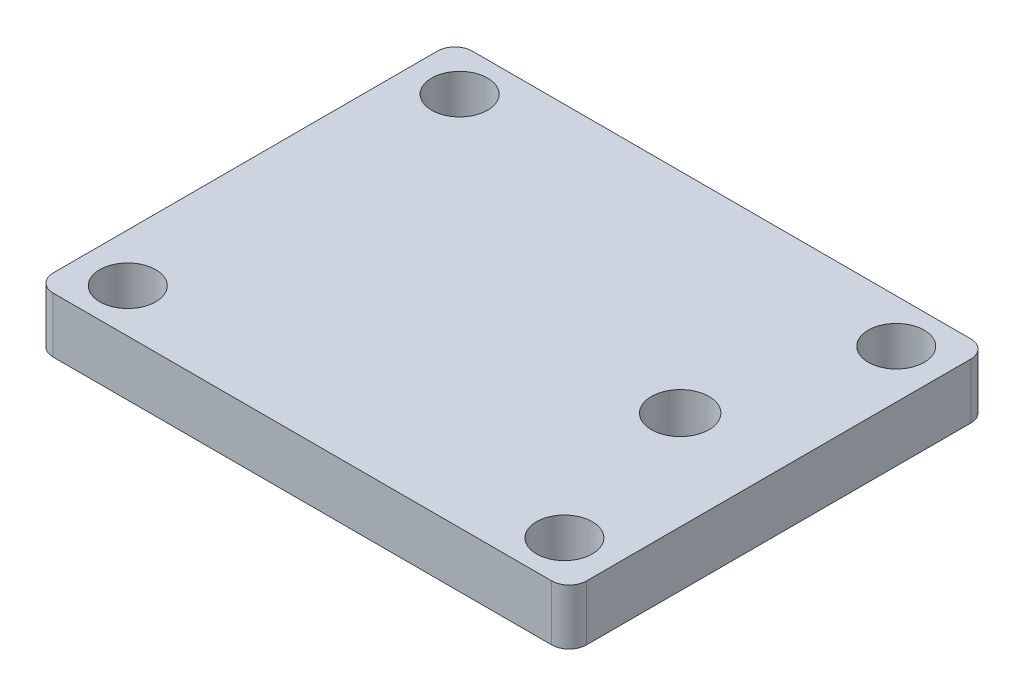
ISO-10303-21;
HEADER;
FILE_DESCRIPTION(('STEP AP214'),'2;1');
FILE_NAME('part.step','',(''),(''),'','','');
FILE_SCHEMA(('AUTOMOTIVE_DESIGN { 1 0 10303 214 1 1 1 1 }'));
ENDSEC;
DATA;
#1=APPLICATION_CONTEXT('core data for automotive mechanical design processes');
#2=APPLICATION_PROTOCOL_DEFINITION('international standard','automotive_design',2000,#1);
#3=PRODUCT_CONTEXT('',#1,'mechanical');
#4=PRODUCT('Part','Part','',(#3));
#5=PRODUCT_RELATED_PRODUCT_CATEGORY('part','',(#4));
#6=PRODUCT_DEFINITION_FORMATION('','',#4);
#7=PRODUCT_DEFINITION_CONTEXT('part definition',#1,'design');
#8=PRODUCT_DEFINITION('design','',#6,#7);
#9=PRODUCT_DEFINITION_SHAPE('','',#8);
#10=(LENGTH_UNIT() NAMED_UNIT(*) SI_UNIT(.MILLI.,.METRE.));
#11=(NAMED_UNIT(*) PLANE_ANGLE_UNIT() SI_UNIT($,.RADIAN.));
#12=(NAMED_UNIT(*) SI_UNIT($,.STERADIAN.) SOLID_ANGLE_UNIT());
#13=UNCERTAINTY_MEASURE_WITH_UNIT(LENGTH_MEASURE(1.E-05),#10,'distance_accuracy_value','');
#14=(GEOMETRIC_REPRESENTATION_CONTEXT(3) GLOBAL_UNCERTAINTY_ASSIGNED_CONTEXT((#13)) GLOBAL_UNIT_ASSIGNED_CONTEXT((#10,
#11,#12)) REPRESENTATION_CONTEXT('',''));
#15=CARTESIAN_POINT('',(0.,0.,0.));
#16=DIRECTION('',(0.,0.,1.));
#17=DIRECTION('',(1.,0.,0.));
#18=AXIS2_PLACEMENT_3D('',#15,#16,#17);
#19=CARTESIAN_POINT('',(0.,3.175,0.));
#20=DIRECTION('',(0.,-1.,0.));
#21=DIRECTION('',(0.,0.,-1.));
#22=AXIS2_PLACEMENT_3D('',#19,#20,#21);
#23=PLANE('',#22);
#24=CARTESIAN_POINT('',(9.62999999999999,3.175,0.));
#25=DIRECTION('',(0.,1.,0.));
#26=DIRECTION('',(0.,0.,1.));
#27=AXIS2_PLACEMENT_3D('',#24,#25,#26);
#28=CIRCLE('',#27,1.65);
#29=CARTESIAN_POINT('',(9.62999999999999,3.175,1.65));
#30=VERTEX_POINT('',#29);
#31=EDGE_CURVE('E234',#30,#30,#28,.T.);
#32=ORIENTED_EDGE('',*,*,#31,.F.);
#33=EDGE_LOOP('',(#32));
#34=FACE_BOUND('',#33,.T.);
#35=DIRECTION('',(0.,0.,-1.));
#36=VECTOR('',#35,1.);
#37=CARTESIAN_POINT('',(15.27,3.175,12.));
#38=LINE('',#37,#36);
#39=CARTESIAN_POINT('',(15.27,3.175,11.));
#40=VERTEX_POINT('',#39);
#41=CARTESIAN_POINT('',(15.27,3.175,-11.));
#42=VERTEX_POINT('',#41);
#43=EDGE_CURVE('E149',#40,#42,#38,.T.);
#44=ORIENTED_EDGE('',*,*,#43,.T.);
#45=CARTESIAN_POINT('',(14.27,3.175,-11.));
#46=DIRECTION('',(0.,-1.,0.));
#47=DIRECTION('',(0.,0.,-1.));
#48=AXIS2_PLACEMENT_3D('',#45,#46,#47);
#49=CIRCLE('',#48,1.);
#50=CARTESIAN_POINT('',(14.27,3.175,-12.));
#51=VERTEX_POINT('',#50);
#52=EDGE_CURVE('E173',#42,#51,#49,.F.);
#53=ORIENTED_EDGE('',*,*,#52,.T.);
#54=DIRECTION('',(-1.,0.,0.));
#55=VECTOR('',#54,1.);
#56=CARTESIAN_POINT('',(-15.27,3.175,-12.));
#57=LINE('',#56,#55);
#58=CARTESIAN_POINT('',(-14.27,3.175,-12.));
#59=VERTEX_POINT('',#58);
#60=EDGE_CURVE('E126',#51,#59,#57,.T.);
#61=ORIENTED_EDGE('',*,*,#60,.T.);
#62=CARTESIAN_POINT('',(-14.27,3.175,-11.));
#63=DIRECTION('',(0.,-1.,0.));
#64=DIRECTION('',(0.,0.,-1.));
#65=AXIS2_PLACEMENT_3D('',#62,#63,#64);
#66=CIRCLE('',#65,1.);
#67=CARTESIAN_POINT('',(-15.27,3.175,-11.));
#68=VERTEX_POINT('',#67);
#69=EDGE_CURVE('E165',#59,#68,#66,.F.);
#70=ORIENTED_EDGE('',*,*,#69,.T.);
#71=DIRECTION('',(0.,0.,1.));
#72=VECTOR('',#71,1.);
#73=CARTESIAN_POINT('',(-15.27,3.175,12.));
#74=LINE('',#73,#72);
#75=CARTESIAN_POINT('',(-15.27,3.175,11.));
#76=VERTEX_POINT('',#75);
#77=EDGE_CURVE('E188',#68,#76,#74,.T.);
#78=ORIENTED_EDGE('',*,*,#77,.T.);
#79=CARTESIAN_POINT('',(-14.27,3.175,11.));
#80=DIRECTION('',(0.,-1.,0.));
#81=DIRECTION('',(0.,0.,-1.));
#82=AXIS2_PLACEMENT_3D('',#79,#80,#81);
#83=CIRCLE('',#82,1.);
#84=CARTESIAN_POINT('',(-14.27,3.175,12.));
#85=VERTEX_POINT('',#84);
#86=EDGE_CURVE('E61',#76,#85,#83,.F.);
#87=ORIENTED_EDGE('',*,*,#86,.T.);
#88=DIRECTION('',(1.,0.,0.));
#89=VECTOR('',#88,1.);
#90=CARTESIAN_POINT('',(-15.27,3.175,12.));
#91=LINE('',#90,#89);
#92=CARTESIAN_POINT('',(14.27,3.175,12.));
#93=VERTEX_POINT('',#92);
#94=EDGE_CURVE('E151',#85,#93,#91,.T.);
#95=ORIENTED_EDGE('',*,*,#94,.T.);
#96=CARTESIAN_POINT('',(14.27,3.175,11.));
#97=DIRECTION('',(0.,-1.,0.));
#98=DIRECTION('',(0.,0.,-1.));
#99=AXIS2_PLACEMENT_3D('',#96,#97,#98);
#100=CIRCLE('',#99,1.);
#101=EDGE_CURVE('E170',#93,#40,#100,.F.);
#102=ORIENTED_EDGE('',*,*,#101,.T.);
#103=EDGE_LOOP('',(#44,#53,#61,#70,#78,#87,#95,#102));
#104=FACE_BOUND('',#103,.T.);
#105=CARTESIAN_POINT('',(-12.5,3.175,-9.5));
#106=DIRECTION('',(0.,1.,0.));
#107=DIRECTION('',(0.,0.,1.));
#108=AXIS2_PLACEMENT_3D('',#105,#106,#107);
#109=CIRCLE('',#108,1.6);
#110=CARTESIAN_POINT('',(-12.5,3.175,-7.9));
#111=VERTEX_POINT('',#110);
#112=EDGE_CURVE('E143',#111,#111,#109,.T.);
#113=ORIENTED_EDGE('',*,*,#112,.F.);
#114=EDGE_LOOP('',(#113));
#115=FACE_BOUND('',#114,.T.);
#116=CARTESIAN_POINT('',(-12.5,3.175,9.5));
#117=DIRECTION('',(0.,1.,0.));
#118=DIRECTION('',(0.,0.,1.));
#119=AXIS2_PLACEMENT_3D('',#116,#117,#118);
#120=CIRCLE('',#119,1.6);
#121=CARTESIAN_POINT('',(-12.5,3.175,11.1));
#122=VERTEX_POINT('',#121);
#123=EDGE_CURVE('E210',#122,#122,#120,.T.);
#124=ORIENTED_EDGE('',*,*,#123,.F.);
#125=EDGE_LOOP('',(#124));
#126=FACE_BOUND('',#125,.T.);
#127=CARTESIAN_POINT('',(12.5,3.175,9.5));
#128=DIRECTION('',(0.,1.,0.));
#129=DIRECTION('',(0.,0.,1.));
#130=AXIS2_PLACEMENT_3D('',#127,#128,#129);
#131=CIRCLE('',#130,1.6);
#132=CARTESIAN_POINT('',(12.5,3.175,11.1));
#133=VERTEX_POINT('',#132);
#134=EDGE_CURVE('E218',#133,#133,#131,.T.);
#135=ORIENTED_EDGE('',*,*,#134,.F.);
#136=EDGE_LOOP('',(#135));
#137=FACE_BOUND('',#136,.T.);
#138=CARTESIAN_POINT('',(12.5,3.175,-9.5));
#139=DIRECTION('',(0.,1.,0.));
#140=DIRECTION('',(0.,0.,1.));
#141=AXIS2_PLACEMENT_3D('',#138,#139,#140);
#142=CIRCLE('',#141,1.6);
#143=CARTESIAN_POINT('',(12.5,3.175,-7.9));
#144=VERTEX_POINT('',#143);
#145=EDGE_CURVE('E226',#144,#144,#142,.T.);
#146=ORIENTED_EDGE('',*,*,#145,.F.);
#147=EDGE_LOOP('',(#146));
#148=FACE_BOUND('',#147,.T.);
#149=ADVANCED_FACE('F38',(#34,#104,#115,#126,#137,#148),#23,.F.);
#150=CARTESIAN_POINT('',(0.,0.,0.));
#151=DIRECTION('',(0.,-1.,0.));
#152=DIRECTION('',(0.,0.,-1.));
#153=AXIS2_PLACEMENT_3D('',#150,#151,#152);
#154=PLANE('',#153);
#155=CARTESIAN_POINT('',(9.62999999999999,0.,0.));
#156=DIRECTION('',(0.,-1.,0.));
#157=DIRECTION('',(0.,0.,-1.));
#158=AXIS2_PLACEMENT_3D('',#155,#156,#157);
#159=CIRCLE('',#158,1.65);
#160=CARTESIAN_POINT('',(9.62999999999999,0.,-1.65));
#161=VERTEX_POINT('',#160);
#162=EDGE_CURVE('E238',#161,#161,#159,.F.);
#163=ORIENTED_EDGE('',*,*,#162,.T.);
#164=EDGE_LOOP('',(#163));
#165=FACE_BOUND('',#164,.T.);
#166=CARTESIAN_POINT('',(12.5,0.,9.5));
#167=DIRECTION('',(0.,1.,0.));
#168=DIRECTION('',(0.,0.,1.));
#169=AXIS2_PLACEMENT_3D('',#166,#167,#168);
#170=CIRCLE('',#169,1.6);
#171=CARTESIAN_POINT('',(12.5,0.,11.1));
#172=VERTEX_POINT('',#171);
#173=EDGE_CURVE('E222',#172,#172,#170,.T.);
#174=ORIENTED_EDGE('',*,*,#173,.T.);
#175=EDGE_LOOP('',(#174));
#176=FACE_BOUND('',#175,.T.);
#177=CARTESIAN_POINT('',(-12.5,0.,-9.5));
#178=DIRECTION('',(0.,1.,0.));
#179=DIRECTION('',(0.,0.,1.));
#180=AXIS2_PLACEMENT_3D('',#177,#178,#179);
#181=CIRCLE('',#180,1.6);
#182=CARTESIAN_POINT('',(-12.5,0.,-7.9));
#183=VERTEX_POINT('',#182);
#184=EDGE_CURVE('E206',#183,#183,#181,.T.);
#185=ORIENTED_EDGE('',*,*,#184,.T.);
#186=EDGE_LOOP('',(#185));
#187=FACE_BOUND('',#186,.T.);
#188=DIRECTION('',(-1.,0.,0.));
#189=VECTOR('',#188,1.);
#190=CARTESIAN_POINT('',(-15.27,0.,-12.));
#191=LINE('',#190,#189);
#192=CARTESIAN_POINT('',(14.27,0.,-12.));
#193=VERTEX_POINT('',#192);
#194=CARTESIAN_POINT('',(-14.27,0.,-12.));
#195=VERTEX_POINT('',#194);
#196=EDGE_CURVE('E123',#193,#195,#191,.T.);
#197=ORIENTED_EDGE('',*,*,#196,.F.);
#198=CARTESIAN_POINT('',(14.27,0.,-11.));
#199=DIRECTION('',(0.,-1.,0.));
#200=DIRECTION('',(0.,0.,-1.));
#201=AXIS2_PLACEMENT_3D('',#198,#199,#200);
#202=CIRCLE('',#201,1.);
#203=CARTESIAN_POINT('',(15.27,0.,-11.));
#204=VERTEX_POINT('',#203);
#205=EDGE_CURVE('E105',#193,#204,#202,.T.);
#206=ORIENTED_EDGE('',*,*,#205,.T.);
#207=DIRECTION('',(0.,0.,-1.));
#208=VECTOR('',#207,1.);
#209=CARTESIAN_POINT('',(15.27,0.,12.));
#210=LINE('',#209,#208);
#211=CARTESIAN_POINT('',(15.27,0.,11.));
#212=VERTEX_POINT('',#211);
#213=EDGE_CURVE('E136',#212,#204,#210,.T.);
#214=ORIENTED_EDGE('',*,*,#213,.F.);
#215=CARTESIAN_POINT('',(14.27,0.,11.));
#216=DIRECTION('',(0.,-1.,0.));
#217=DIRECTION('',(0.,0.,-1.));
#218=AXIS2_PLACEMENT_3D('',#215,#216,#217);
#219=CIRCLE('',#218,1.);
#220=CARTESIAN_POINT('',(14.27,0.,12.));
#221=VERTEX_POINT('',#220);
#222=EDGE_CURVE('E117',#212,#221,#219,.T.);
#223=ORIENTED_EDGE('',*,*,#222,.T.);
#224=DIRECTION('',(1.,0.,0.));
#225=VECTOR('',#224,1.);
#226=CARTESIAN_POINT('',(-15.27,0.,12.));
#227=LINE('',#226,#225);
#228=CARTESIAN_POINT('',(-14.27,0.,12.));
#229=VERTEX_POINT('',#228);
#230=EDGE_CURVE('E141',#229,#221,#227,.T.);
#231=ORIENTED_EDGE('',*,*,#230,.F.);
#232=CARTESIAN_POINT('',(-14.27,0.,11.));
#233=DIRECTION('',(0.,-1.,0.));
#234=DIRECTION('',(0.,0.,-1.));
#235=AXIS2_PLACEMENT_3D('',#232,#233,#234);
#236=CIRCLE('',#235,1.);
#237=CARTESIAN_POINT('',(-15.27,0.,11.));
#238=VERTEX_POINT('',#237);
#239=EDGE_CURVE('E155',#229,#238,#236,.T.);
#240=ORIENTED_EDGE('',*,*,#239,.T.);
#241=DIRECTION('',(0.,0.,1.));
#242=VECTOR('',#241,1.);
#243=CARTESIAN_POINT('',(-15.27,0.,12.));
#244=LINE('',#243,#242);
#245=CARTESIAN_POINT('',(-15.27,0.,-11.));
#246=VERTEX_POINT('',#245);
#247=EDGE_CURVE('E135',#246,#238,#244,.T.);
#248=ORIENTED_EDGE('',*,*,#247,.F.);
#249=CARTESIAN_POINT('',(-14.27,0.,-11.));
#250=DIRECTION('',(0.,-1.,0.));
#251=DIRECTION('',(0.,0.,-1.));
#252=AXIS2_PLACEMENT_3D('',#249,#250,#251);
#253=CIRCLE('',#252,1.);
#254=EDGE_CURVE('E128',#246,#195,#253,.T.);
#255=ORIENTED_EDGE('',*,*,#254,.T.);
#256=EDGE_LOOP('',(#197,#206,#214,#223,#231,#240,#248,#255));
#257=FACE_BOUND('',#256,.T.);
#258=CARTESIAN_POINT('',(-12.5,0.,9.5));
#259=DIRECTION('',(0.,1.,0.));
#260=DIRECTION('',(0.,0.,1.));
#261=AXIS2_PLACEMENT_3D('',#258,#259,#260);
#262=CIRCLE('',#261,1.6);
#263=CARTESIAN_POINT('',(-12.5,0.,11.1));
#264=VERTEX_POINT('',#263);
#265=EDGE_CURVE('E214',#264,#264,#262,.T.);
#266=ORIENTED_EDGE('',*,*,#265,.T.);
#267=EDGE_LOOP('',(#266));
#268=FACE_BOUND('',#267,.T.);
#269=CARTESIAN_POINT('',(12.5,0.,-9.5));
#270=DIRECTION('',(0.,1.,0.));
#271=DIRECTION('',(0.,0.,1.));
#272=AXIS2_PLACEMENT_3D('',#269,#270,#271);
#273=CIRCLE('',#272,1.6);
#274=CARTESIAN_POINT('',(12.5,0.,-7.9));
#275=VERTEX_POINT('',#274);
#276=EDGE_CURVE('E230',#275,#275,#273,.T.);
#277=ORIENTED_EDGE('',*,*,#276,.T.);
#278=EDGE_LOOP('',(#277));
#279=FACE_BOUND('',#278,.T.);
#280=ADVANCED_FACE('F131',(#165,#176,#187,#257,#268,#279),#154,.T.);
#281=CARTESIAN_POINT('',(15.27,3.175,12.));
#282=DIRECTION('',(-1.,0.,0.));
#283=DIRECTION('',(0.,0.,1.));
#284=AXIS2_PLACEMENT_3D('',#281,#282,#283);
#285=PLANE('',#284);
#286=ORIENTED_EDGE('',*,*,#213,.T.);
#287=DIRECTION('',(0.,-1.,0.));
#288=VECTOR('',#287,1.);
#289=CARTESIAN_POINT('',(15.27,3.175,-11.));
#290=LINE('',#289,#288);
#291=EDGE_CURVE('E110',#204,#42,#290,.F.);
#292=ORIENTED_EDGE('',*,*,#291,.T.);
#293=ORIENTED_EDGE('',*,*,#43,.F.);
#294=DIRECTION('',(0.,-1.,0.));
#295=VECTOR('',#294,1.);
#296=CARTESIAN_POINT('',(15.27,3.175,11.));
#297=LINE('',#296,#295);
#298=EDGE_CURVE('E116',#40,#212,#297,.T.);
#299=ORIENTED_EDGE('',*,*,#298,.T.);
#300=EDGE_LOOP('',(#286,#292,#293,#299));
#301=FACE_BOUND('',#300,.T.);
#302=ADVANCED_FACE('F268',(#301),#285,.F.);
#303=CARTESIAN_POINT('',(-15.27,3.175,-12.));
#304=DIRECTION('',(0.,0.,1.));
#305=DIRECTION('',(1.,0.,0.));
#306=AXIS2_PLACEMENT_3D('',#303,#304,#305);
#307=PLANE('',#306);
#308=ORIENTED_EDGE('',*,*,#60,.F.);
#309=DIRECTION('',(0.,-1.,0.));
#310=VECTOR('',#309,1.);
#311=CARTESIAN_POINT('',(14.27,3.175,-12.));
#312=LINE('',#311,#310);
#313=EDGE_CURVE('E109',#51,#193,#312,.T.);
#314=ORIENTED_EDGE('',*,*,#313,.T.);
#315=ORIENTED_EDGE('',*,*,#196,.T.);
#316=DIRECTION('',(0.,-1.,0.));
#317=VECTOR('',#316,1.);
#318=CARTESIAN_POINT('',(-14.27,3.175,-12.));
#319=LINE('',#318,#317);
#320=EDGE_CURVE('E129',#195,#59,#319,.F.);
#321=ORIENTED_EDGE('',*,*,#320,.T.);
#322=EDGE_LOOP('',(#308,#314,#315,#321));
#323=FACE_BOUND('',#322,.T.);
#324=ADVANCED_FACE('F122',(#323),#307,.F.);
#325=CARTESIAN_POINT('',(-15.27,3.175,12.));
#326=DIRECTION('',(1.,0.,0.));
#327=DIRECTION('',(0.,0.,-1.));
#328=AXIS2_PLACEMENT_3D('',#325,#326,#327);
#329=PLANE('',#328);
#330=ORIENTED_EDGE('',*,*,#247,.T.);
#331=DIRECTION('',(0.,-1.,0.));
#332=VECTOR('',#331,1.);
#333=CARTESIAN_POINT('',(-15.27,3.175,11.));
#334=LINE('',#333,#332);
#335=EDGE_CURVE('E11',#238,#76,#334,.F.);
#336=ORIENTED_EDGE('',*,*,#335,.T.);
#337=ORIENTED_EDGE('',*,*,#77,.F.);
#338=DIRECTION('',(0.,-1.,0.));
#339=VECTOR('',#338,1.);
#340=CARTESIAN_POINT('',(-15.27,3.175,-11.));
#341=LINE('',#340,#339);
#342=EDGE_CURVE('E47',#68,#246,#341,.T.);
#343=ORIENTED_EDGE('',*,*,#342,.T.);
#344=EDGE_LOOP('',(#330,#336,#337,#343));
#345=FACE_BOUND('',#344,.T.);
#346=ADVANCED_FACE('F186',(#345),#329,.F.);
#347=CARTESIAN_POINT('',(-15.27,3.175,12.));
#348=DIRECTION('',(0.,0.,-1.));
#349=DIRECTION('',(-1.,0.,0.));
#350=AXIS2_PLACEMENT_3D('',#347,#348,#349);
#351=PLANE('',#350);
#352=ORIENTED_EDGE('',*,*,#230,.T.);
#353=DIRECTION('',(0.,-1.,0.));
#354=VECTOR('',#353,1.);
#355=CARTESIAN_POINT('',(14.27,3.175,12.));
#356=LINE('',#355,#354);
#357=EDGE_CURVE('E54',#221,#93,#356,.F.);
#358=ORIENTED_EDGE('',*,*,#357,.T.);
#359=ORIENTED_EDGE('',*,*,#94,.F.);
#360=DIRECTION('',(0.,-1.,0.));
#361=VECTOR('',#360,1.);
#362=CARTESIAN_POINT('',(-14.27,3.175,12.));
#363=LINE('',#362,#361);
#364=EDGE_CURVE('E176',#85,#229,#363,.T.);
#365=ORIENTED_EDGE('',*,*,#364,.T.);
#366=EDGE_LOOP('',(#352,#358,#359,#365));
#367=FACE_BOUND('',#366,.T.);
#368=ADVANCED_FACE('F195',(#367),#351,.F.);
#369=CARTESIAN_POINT('',(-12.5,3.175,-9.5));
#370=DIRECTION('',(0.,-1.,0.));
#371=DIRECTION('',(0.,0.,-1.));
#372=AXIS2_PLACEMENT_3D('',#369,#370,#371);
#373=CYLINDRICAL_SURFACE('',#372,1.6);
#374=ORIENTED_EDGE('',*,*,#112,.T.);
#375=EDGE_LOOP('',(#374));
#376=FACE_BOUND('',#375,.T.);
#377=ORIENTED_EDGE('',*,*,#184,.F.);
#378=EDGE_LOOP('',(#377));
#379=FACE_BOUND('',#378,.T.);
#380=ADVANCED_FACE('F282',(#376,#379),#373,.F.);
#381=CARTESIAN_POINT('',(-12.5,3.175,9.5));
#382=DIRECTION('',(0.,-1.,0.));
#383=DIRECTION('',(0.,0.,-1.));
#384=AXIS2_PLACEMENT_3D('',#381,#382,#383);
#385=CYLINDRICAL_SURFACE('',#384,1.6);
#386=ORIENTED_EDGE('',*,*,#123,.T.);
#387=EDGE_LOOP('',(#386));
#388=FACE_BOUND('',#387,.T.);
#389=ORIENTED_EDGE('',*,*,#265,.F.);
#390=EDGE_LOOP('',(#389));
#391=FACE_BOUND('',#390,.T.);
#392=ADVANCED_FACE('F306',(#388,#391),#385,.F.);
#393=CARTESIAN_POINT('',(12.5,3.175,9.5));
#394=DIRECTION('',(0.,-1.,0.));
#395=DIRECTION('',(0.,0.,-1.));
#396=AXIS2_PLACEMENT_3D('',#393,#394,#395);
#397=CYLINDRICAL_SURFACE('',#396,1.6);
#398=ORIENTED_EDGE('',*,*,#134,.T.);
#399=EDGE_LOOP('',(#398));
#400=FACE_BOUND('',#399,.T.);
#401=ORIENTED_EDGE('',*,*,#173,.F.);
#402=EDGE_LOOP('',(#401));
#403=FACE_BOUND('',#402,.T.);
#404=ADVANCED_FACE('F263',(#400,#403),#397,.F.);
#405=CARTESIAN_POINT('',(12.5,3.175,-9.5));
#406=DIRECTION('',(0.,-1.,0.));
#407=DIRECTION('',(0.,0.,-1.));
#408=AXIS2_PLACEMENT_3D('',#405,#406,#407);
#409=CYLINDRICAL_SURFACE('',#408,1.6);
#410=ORIENTED_EDGE('',*,*,#145,.T.);
#411=EDGE_LOOP('',(#410));
#412=FACE_BOUND('',#411,.T.);
#413=ORIENTED_EDGE('',*,*,#276,.F.);
#414=EDGE_LOOP('',(#413));
#415=FACE_BOUND('',#414,.T.);
#416=ADVANCED_FACE('F260',(#412,#415),#409,.F.);
#417=CARTESIAN_POINT('',(14.27,3.175,-11.));
#418=DIRECTION('',(0.,-1.,0.));
#419=DIRECTION('',(0.,0.,-1.));
#420=AXIS2_PLACEMENT_3D('',#417,#418,#419);
#421=CYLINDRICAL_SURFACE('',#420,1.);
#422=ORIENTED_EDGE('',*,*,#52,.F.);
#423=ORIENTED_EDGE('',*,*,#291,.F.);
#424=ORIENTED_EDGE('',*,*,#205,.F.);
#425=ORIENTED_EDGE('',*,*,#313,.F.);
#426=EDGE_LOOP('',(#422,#423,#424,#425));
#427=FACE_BOUND('',#426,.T.);
#428=ADVANCED_FACE('F108',(#427),#421,.T.);
#429=CARTESIAN_POINT('',(14.27,3.175,11.));
#430=DIRECTION('',(0.,-1.,0.));
#431=DIRECTION('',(0.,0.,-1.));
#432=AXIS2_PLACEMENT_3D('',#429,#430,#431);
#433=CYLINDRICAL_SURFACE('',#432,1.);
#434=ORIENTED_EDGE('',*,*,#101,.F.);
#435=ORIENTED_EDGE('',*,*,#357,.F.);
#436=ORIENTED_EDGE('',*,*,#222,.F.);
#437=ORIENTED_EDGE('',*,*,#298,.F.);
#438=EDGE_LOOP('',(#434,#435,#436,#437));
#439=FACE_BOUND('',#438,.T.);
#440=ADVANCED_FACE('F289',(#439),#433,.T.);
#441=CARTESIAN_POINT('',(-14.27,3.175,11.));
#442=DIRECTION('',(0.,-1.,0.));
#443=DIRECTION('',(0.,0.,-1.));
#444=AXIS2_PLACEMENT_3D('',#441,#442,#443);
#445=CYLINDRICAL_SURFACE('',#444,1.);
#446=ORIENTED_EDGE('',*,*,#86,.F.);
#447=ORIENTED_EDGE('',*,*,#335,.F.);
#448=ORIENTED_EDGE('',*,*,#239,.F.);
#449=ORIENTED_EDGE('',*,*,#364,.F.);
#450=EDGE_LOOP('',(#446,#447,#448,#449));
#451=FACE_BOUND('',#450,.T.);
#452=ADVANCED_FACE('F194',(#451),#445,.T.);
#453=CARTESIAN_POINT('',(-14.27,3.175,-11.));
#454=DIRECTION('',(0.,-1.,0.));
#455=DIRECTION('',(0.,0.,-1.));
#456=AXIS2_PLACEMENT_3D('',#453,#454,#455);
#457=CYLINDRICAL_SURFACE('',#456,1.);
#458=ORIENTED_EDGE('',*,*,#69,.F.);
#459=ORIENTED_EDGE('',*,*,#320,.F.);
#460=ORIENTED_EDGE('',*,*,#254,.F.);
#461=ORIENTED_EDGE('',*,*,#342,.F.);
#462=EDGE_LOOP('',(#458,#459,#460,#461));
#463=FACE_BOUND('',#462,.T.);
#464=ADVANCED_FACE('F40',(#463),#457,.T.);
#465=CARTESIAN_POINT('',(9.62999999999999,-0.00100000000000013,0.));
#466=DIRECTION('',(0.,1.,0.));
#467=DIRECTION('',(0.,0.,1.));
#468=AXIS2_PLACEMENT_3D('',#465,#466,#467);
#469=CYLINDRICAL_SURFACE('',#468,1.65);
#470=ORIENTED_EDGE('',*,*,#162,.F.);
#471=EDGE_LOOP('',(#470));
#472=FACE_BOUND('',#471,.T.);
#473=ORIENTED_EDGE('',*,*,#31,.T.);
#474=EDGE_LOOP('',(#473));
#475=FACE_BOUND('',#474,.T.);
#476=ADVANCED_FACE('F246',(#472,#475),#469,.F.);
#477=CLOSED_SHELL('',(#149,#280,#302,#324,#346,#368,#380,#392,#404,#416,#428,#440,#452,#464,#476));
#478=MANIFOLD_SOLID_BREP('B2',#477);
#479=ADVANCED_BREP_SHAPE_REPRESENTATION('',(#18,#478),#14);
#480=SHAPE_DEFINITION_REPRESENTATION(#9,#479);
ENDSEC;
END-ISO-10303-21;
